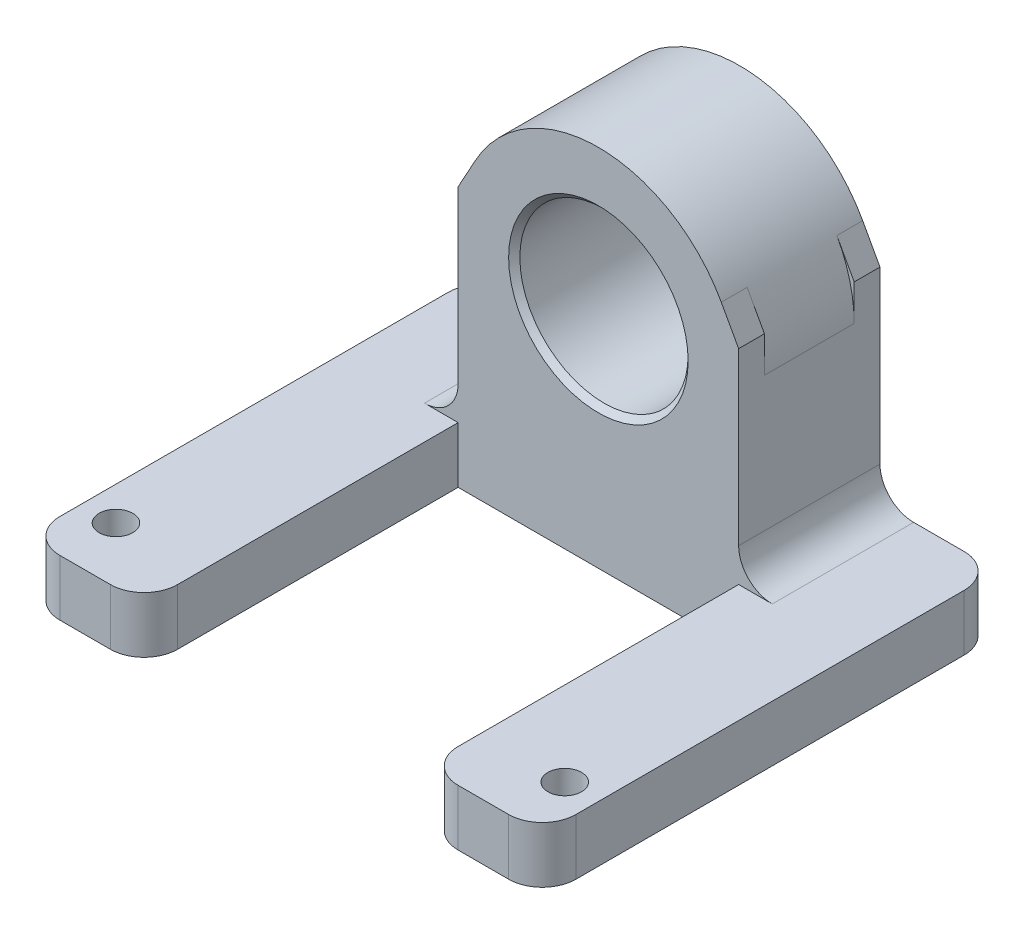
ISO-10303-21;
HEADER;
FILE_DESCRIPTION(('STEP AP214'),'2;1');
FILE_NAME('part.step','',(''),(''),'','','');
FILE_SCHEMA(('AUTOMOTIVE_DESIGN { 1 0 10303 214 1 1 1 1 }'));
ENDSEC;
DATA;
#1=APPLICATION_CONTEXT('core data for automotive mechanical design processes');
#2=APPLICATION_PROTOCOL_DEFINITION('international standard','automotive_design',2000,#1);
#3=PRODUCT_CONTEXT('',#1,'mechanical');
#4=PRODUCT('Part','Part','',(#3));
#5=PRODUCT_RELATED_PRODUCT_CATEGORY('part','',(#4));
#6=PRODUCT_DEFINITION_FORMATION('','',#4);
#7=PRODUCT_DEFINITION_CONTEXT('part definition',#1,'design');
#8=PRODUCT_DEFINITION('design','',#6,#7);
#9=PRODUCT_DEFINITION_SHAPE('','',#8);
#10=(LENGTH_UNIT() NAMED_UNIT(*) SI_UNIT(.MILLI.,.METRE.));
#11=(NAMED_UNIT(*) PLANE_ANGLE_UNIT() SI_UNIT($,.RADIAN.));
#12=(NAMED_UNIT(*) SI_UNIT($,.STERADIAN.) SOLID_ANGLE_UNIT());
#13=UNCERTAINTY_MEASURE_WITH_UNIT(LENGTH_MEASURE(1.E-05),#10,'distance_accuracy_value','');
#14=(GEOMETRIC_REPRESENTATION_CONTEXT(3) GLOBAL_UNCERTAINTY_ASSIGNED_CONTEXT((#13)) GLOBAL_UNIT_ASSIGNED_CONTEXT((#10,
#11,#12)) REPRESENTATION_CONTEXT('',''));
#15=CARTESIAN_POINT('',(0.,0.,0.));
#16=DIRECTION('',(0.,0.,1.));
#17=DIRECTION('',(1.,0.,0.));
#18=AXIS2_PLACEMENT_3D('',#15,#16,#17);
#19=CARTESIAN_POINT('',(22.5,-15.,-4.));
#20=DIRECTION('',(0.,-1.,0.));
#21=DIRECTION('',(1.,0.,0.));
#22=AXIS2_PLACEMENT_3D('',#19,#20,#21);
#23=PLANE('',#22);
#24=DIRECTION('',(-1.,0.,0.));
#25=VECTOR('',#24,1.);
#26=CARTESIAN_POINT('',(-22.5,-15.,-6.3));
#27=LINE('',#26,#25);
#28=CARTESIAN_POINT('',(-15.5,-15.,-6.3));
#29=VERTEX_POINT('',#28);
#30=CARTESIAN_POINT('',(-20.,-15.,-6.3));
#31=VERTEX_POINT('',#30);
#32=EDGE_CURVE('E294',#29,#31,#27,.T.);
#33=ORIENTED_EDGE('',*,*,#32,.T.);
#34=CARTESIAN_POINT('',(-20.,-15.,-3.3));
#35=DIRECTION('',(0.,-1.,0.));
#36=DIRECTION('',(1.,0.,0.));
#37=AXIS2_PLACEMENT_3D('',#34,#35,#36);
#38=CIRCLE('',#37,3.);
#39=CARTESIAN_POINT('',(-23.,-15.,-3.3));
#40=VERTEX_POINT('',#39);
#41=EDGE_CURVE('E475',#31,#40,#38,.F.);
#42=ORIENTED_EDGE('',*,*,#41,.T.);
#43=DIRECTION('',(0.,0.,1.));
#44=VECTOR('',#43,1.);
#45=CARTESIAN_POINT('',(-23.,-15.,-6.3));
#46=LINE('',#45,#44);
#47=CARTESIAN_POINT('',(-23.,-15.,31.3));
#48=VERTEX_POINT('',#47);
#49=EDGE_CURVE('E312',#40,#48,#46,.T.);
#50=ORIENTED_EDGE('',*,*,#49,.T.);
#51=CARTESIAN_POINT('',(-20.,-15.,31.3));
#52=DIRECTION('',(0.,-1.,0.));
#53=DIRECTION('',(1.,0.,0.));
#54=AXIS2_PLACEMENT_3D('',#51,#52,#53);
#55=CIRCLE('',#54,3.);
#56=CARTESIAN_POINT('',(-20.,-15.,34.3));
#57=VERTEX_POINT('',#56);
#58=EDGE_CURVE('E472',#48,#57,#55,.F.);
#59=ORIENTED_EDGE('',*,*,#58,.T.);
#60=DIRECTION('',(-1.,0.,0.));
#61=VECTOR('',#60,1.);
#62=CARTESIAN_POINT('',(-22.5,-15.,34.3));
#63=LINE('',#62,#61);
#64=CARTESIAN_POINT('',(-15.5,-15.,34.3));
#65=VERTEX_POINT('',#64);
#66=EDGE_CURVE('E283',#65,#57,#63,.T.);
#67=ORIENTED_EDGE('',*,*,#66,.F.);
#68=CARTESIAN_POINT('',(-15.5,-15.,31.3));
#69=DIRECTION('',(0.,-1.,0.));
#70=DIRECTION('',(1.,0.,0.));
#71=AXIS2_PLACEMENT_3D('',#68,#69,#70);
#72=CIRCLE('',#71,3.);
#73=CARTESIAN_POINT('',(-12.5,-15.,31.3));
#74=VERTEX_POINT('',#73);
#75=EDGE_CURVE('E469',#65,#74,#72,.F.);
#76=ORIENTED_EDGE('',*,*,#75,.T.);
#77=DIRECTION('',(0.,0.,-1.));
#78=VECTOR('',#77,1.);
#79=CARTESIAN_POINT('',(-12.5,-15.,-4.));
#80=LINE('',#79,#78);
#81=CARTESIAN_POINT('',(-12.5,-15.,6.3));
#82=VERTEX_POINT('',#81);
#83=EDGE_CURVE('E254',#74,#82,#80,.T.);
#84=ORIENTED_EDGE('',*,*,#83,.T.);
#85=DIRECTION('',(-1.,0.,0.));
#86=VECTOR('',#85,1.);
#87=CARTESIAN_POINT('',(22.5,-15.,6.3));
#88=LINE('',#87,#86);
#89=CARTESIAN_POINT('',(-15.5,-15.,6.3));
#90=VERTEX_POINT('',#89);
#91=EDGE_CURVE('E63',#82,#90,#88,.T.);
#92=ORIENTED_EDGE('',*,*,#91,.T.);
#93=DIRECTION('',(0.,0.,1.));
#94=VECTOR('',#93,1.);
#95=CARTESIAN_POINT('',(-15.5,-15.,-6.3));
#96=LINE('',#95,#94);
#97=EDGE_CURVE('E464',#90,#29,#96,.F.);
#98=ORIENTED_EDGE('',*,*,#97,.T.);
#99=EDGE_LOOP('',(#33,#42,#50,#59,#67,#76,#84,#92,#98));
#100=FACE_BOUND('',#99,.T.);
#101=CARTESIAN_POINT('',(-20.,-15.,29.3));
#102=DIRECTION('',(0.,-1.,0.));
#103=DIRECTION('',(1.,0.,0.));
#104=AXIS2_PLACEMENT_3D('',#101,#102,#103);
#105=CIRCLE('',#104,1.5);
#106=CARTESIAN_POINT('',(-18.5,-15.,29.3));
#107=VERTEX_POINT('',#106);
#108=EDGE_CURVE('E288',#107,#107,#105,.T.);
#109=ORIENTED_EDGE('',*,*,#108,.T.);
#110=EDGE_LOOP('',(#109));
#111=FACE_BOUND('',#110,.T.);
#112=ADVANCED_FACE('F47',(#100,#111),#23,.F.);
#113=CARTESIAN_POINT('',(0.,0.,34.3));
#114=DIRECTION('',(0.,0.,-1.));
#115=DIRECTION('',(-1.,0.,0.));
#116=AXIS2_PLACEMENT_3D('',#113,#114,#115);
#117=PLANE('',#116);
#118=ORIENTED_EDGE('',*,*,#66,.T.);
#119=DIRECTION('',(0.,-1.,0.));
#120=VECTOR('',#119,1.);
#121=CARTESIAN_POINT('',(-20.,-20.,34.3));
#122=LINE('',#121,#120);
#123=CARTESIAN_POINT('',(-20.,-20.,34.3));
#124=VERTEX_POINT('',#123);
#125=EDGE_CURVE('E482',#57,#124,#122,.T.);
#126=ORIENTED_EDGE('',*,*,#125,.T.);
#127=DIRECTION('',(1.,0.,0.));
#128=VECTOR('',#127,1.);
#129=CARTESIAN_POINT('',(-22.5,-20.,34.3));
#130=LINE('',#129,#128);
#131=CARTESIAN_POINT('',(-15.5,-20.,34.3));
#132=VERTEX_POINT('',#131);
#133=EDGE_CURVE('E293',#124,#132,#130,.T.);
#134=ORIENTED_EDGE('',*,*,#133,.T.);
#135=DIRECTION('',(0.,1.,0.));
#136=VECTOR('',#135,1.);
#137=CARTESIAN_POINT('',(-15.5,0.,34.3));
#138=LINE('',#137,#136);
#139=EDGE_CURVE('E478',#132,#65,#138,.T.);
#140=ORIENTED_EDGE('',*,*,#139,.T.);
#141=EDGE_LOOP('',(#118,#126,#134,#140));
#142=FACE_BOUND('',#141,.T.);
#143=ADVANCED_FACE('F639',(#142),#117,.F.);
#144=CARTESIAN_POINT('',(22.5,-15.,6.3));
#145=DIRECTION('',(-0.876495540852586,-0.481409977945547,0.));
#146=DIRECTION('',(0.481409977945547,-0.876495540852586,0.));
#147=AXIS2_PLACEMENT_3D('',#144,#145,#146);
#148=PLANE('',#147);
#149=DIRECTION('',(-0.481409977945547,0.876495540852586,0.));
#150=VECTOR('',#149,1.);
#151=CARTESIAN_POINT('',(22.5,-15.,-4.));
#152=LINE('',#151,#150);
#153=CARTESIAN_POINT('',(12.5,3.2068420059156,-4.));
#154=VERTEX_POINT('',#153);
#155=CARTESIAN_POINT('',(10.9561942606573,6.01762472431933,-4.));
#156=VERTEX_POINT('',#155);
#157=EDGE_CURVE('E316',#154,#156,#152,.T.);
#158=ORIENTED_EDGE('',*,*,#157,.F.);
#159=DIRECTION('',(0.,0.,-1.));
#160=VECTOR('',#159,1.);
#161=CARTESIAN_POINT('',(12.5,3.2068420059156,6.3));
#162=LINE('',#161,#160);
#163=CARTESIAN_POINT('',(12.5,3.20684200591559,-6.3));
#164=VERTEX_POINT('',#163);
#165=EDGE_CURVE('E547',#154,#164,#162,.T.);
#166=ORIENTED_EDGE('',*,*,#165,.T.);
#167=DIRECTION('',(-0.481409977945547,0.876495540852586,0.));
#168=VECTOR('',#167,1.);
#169=CARTESIAN_POINT('',(22.5,-15.,-6.3));
#170=LINE('',#169,#168);
#171=CARTESIAN_POINT('',(10.9561942606573,6.01762472431933,-6.3));
#172=VERTEX_POINT('',#171);
#173=EDGE_CURVE('E335',#164,#172,#170,.T.);
#174=ORIENTED_EDGE('',*,*,#173,.T.);
#175=DIRECTION('',(0.,0.,-1.));
#176=VECTOR('',#175,1.);
#177=CARTESIAN_POINT('',(10.9561942606573,6.01762472431933,6.3));
#178=LINE('',#177,#176);
#179=EDGE_CURVE('E382',#156,#172,#178,.T.);
#180=ORIENTED_EDGE('',*,*,#179,.F.);
#181=EDGE_LOOP('',(#158,#166,#174,#180));
#182=FACE_BOUND('',#181,.T.);
#183=ADVANCED_FACE('F596',(#182),#148,.F.);
#184=CARTESIAN_POINT('',(-22.5,-15.,6.3));
#185=DIRECTION('',(0.876495540852587,-0.481409977945547,0.));
#186=DIRECTION('',(0.481409977945547,0.876495540852587,0.));
#187=AXIS2_PLACEMENT_3D('',#184,#185,#186);
#188=PLANE('',#187);
#189=DIRECTION('',(-0.481409977945547,-0.876495540852586,0.));
#190=VECTOR('',#189,1.);
#191=CARTESIAN_POINT('',(-22.5,-15.,-6.3));
#192=LINE('',#191,#190);
#193=CARTESIAN_POINT('',(-10.9561942606573,6.01762472431933,-6.3));
#194=VERTEX_POINT('',#193);
#195=CARTESIAN_POINT('',(-12.5,3.20684200591561,-6.3));
#196=VERTEX_POINT('',#195);
#197=EDGE_CURVE('E371',#194,#196,#192,.T.);
#198=ORIENTED_EDGE('',*,*,#197,.T.);
#199=DIRECTION('',(0.,0.,1.));
#200=VECTOR('',#199,1.);
#201=CARTESIAN_POINT('',(-12.5,3.2068420059156,6.3));
#202=LINE('',#201,#200);
#203=CARTESIAN_POINT('',(-12.5,3.2068420059156,-4.));
#204=VERTEX_POINT('',#203);
#205=EDGE_CURVE('E532',#196,#204,#202,.T.);
#206=ORIENTED_EDGE('',*,*,#205,.T.);
#207=DIRECTION('',(-0.481409977945547,-0.876495540852586,0.));
#208=VECTOR('',#207,1.);
#209=CARTESIAN_POINT('',(-10.9561942606573,6.01762472431933,-4.));
#210=LINE('',#209,#208);
#211=CARTESIAN_POINT('',(-10.9561942606573,6.01762472431933,-4.));
#212=VERTEX_POINT('',#211);
#213=EDGE_CURVE('E336',#212,#204,#210,.T.);
#214=ORIENTED_EDGE('',*,*,#213,.F.);
#215=DIRECTION('',(0.,0.,-1.));
#216=VECTOR('',#215,1.);
#217=CARTESIAN_POINT('',(-10.9561942606573,6.01762472431933,6.3));
#218=LINE('',#217,#216);
#219=EDGE_CURVE('E364',#212,#194,#218,.T.);
#220=ORIENTED_EDGE('',*,*,#219,.T.);
#221=EDGE_LOOP('',(#198,#206,#214,#220));
#222=FACE_BOUND('',#221,.T.);
#223=ADVANCED_FACE('F585',(#222),#188,.F.);
#224=CARTESIAN_POINT('',(0.,0.,6.3));
#225=DIRECTION('',(0.,0.,1.));
#226=DIRECTION('',(1.,0.,0.));
#227=AXIS2_PLACEMENT_3D('',#224,#225,#226);
#228=PLANE('',#227);
#229=DIRECTION('',(0.,1.,0.));
#230=VECTOR('',#229,1.);
#231=CARTESIAN_POINT('',(-12.5,-15.,6.3));
#232=LINE('',#231,#230);
#233=CARTESIAN_POINT('',(-12.5,-12.,6.3));
#234=VERTEX_POINT('',#233);
#235=CARTESIAN_POINT('',(-12.5,3.20684200591561,6.3));
#236=VERTEX_POINT('',#235);
#237=EDGE_CURVE('E566',#234,#236,#232,.T.);
#238=ORIENTED_EDGE('',*,*,#237,.F.);
#239=CARTESIAN_POINT('',(-15.5,-12.,6.3));
#240=DIRECTION('',(0.,0.,1.));
#241=DIRECTION('',(1.,0.,0.));
#242=AXIS2_PLACEMENT_3D('',#239,#240,#241);
#243=CIRCLE('',#242,3.);
#244=EDGE_CURVE('E505',#234,#90,#243,.F.);
#245=ORIENTED_EDGE('',*,*,#244,.T.);
#246=ORIENTED_EDGE('',*,*,#91,.F.);
#247=DIRECTION('',(0.,1.,0.));
#248=VECTOR('',#247,1.);
#249=CARTESIAN_POINT('',(-12.5,-20.,6.3));
#250=LINE('',#249,#248);
#251=CARTESIAN_POINT('',(-12.5,-20.,6.3));
#252=VERTEX_POINT('',#251);
#253=EDGE_CURVE('E255',#252,#82,#250,.T.);
#254=ORIENTED_EDGE('',*,*,#253,.F.);
#255=DIRECTION('',(-1.,0.,0.));
#256=VECTOR('',#255,1.);
#257=CARTESIAN_POINT('',(-12.5,-20.,6.3));
#258=LINE('',#257,#256);
#259=CARTESIAN_POINT('',(12.5,-20.,6.3));
#260=VERTEX_POINT('',#259);
#261=EDGE_CURVE('E261',#260,#252,#258,.T.);
#262=ORIENTED_EDGE('',*,*,#261,.F.);
#263=DIRECTION('',(0.,1.,0.));
#264=VECTOR('',#263,1.);
#265=CARTESIAN_POINT('',(12.5,-20.,6.3));
#266=LINE('',#265,#264);
#267=CARTESIAN_POINT('',(12.5,-15.,6.3));
#268=VERTEX_POINT('',#267);
#269=EDGE_CURVE('E249',#260,#268,#266,.T.);
#270=ORIENTED_EDGE('',*,*,#269,.T.);
#271=DIRECTION('',(-1.,0.,0.));
#272=VECTOR('',#271,1.);
#273=CARTESIAN_POINT('',(22.5,-15.,6.3));
#274=LINE('',#273,#272);
#275=CARTESIAN_POINT('',(15.5,-15.,6.3));
#276=VERTEX_POINT('',#275);
#277=EDGE_CURVE('E231',#276,#268,#274,.T.);
#278=ORIENTED_EDGE('',*,*,#277,.F.);
#279=CARTESIAN_POINT('',(15.5,-12.,6.3));
#280=DIRECTION('',(0.,0.,1.));
#281=DIRECTION('',(1.,0.,0.));
#282=AXIS2_PLACEMENT_3D('',#279,#280,#281);
#283=CIRCLE('',#282,3.);
#284=CARTESIAN_POINT('',(12.5,-12.,6.3));
#285=VERTEX_POINT('',#284);
#286=EDGE_CURVE('E56',#276,#285,#283,.F.);
#287=ORIENTED_EDGE('',*,*,#286,.T.);
#288=DIRECTION('',(0.,-1.,0.));
#289=VECTOR('',#288,1.);
#290=CARTESIAN_POINT('',(12.5,-15.,6.3));
#291=LINE('',#290,#289);
#292=CARTESIAN_POINT('',(12.5,3.2068420059156,6.3));
#293=VERTEX_POINT('',#292);
#294=EDGE_CURVE('E563',#293,#285,#291,.T.);
#295=ORIENTED_EDGE('',*,*,#294,.F.);
#296=DIRECTION('',(-0.481409977945547,0.876495540852586,0.));
#297=VECTOR('',#296,1.);
#298=CARTESIAN_POINT('',(22.5,-15.,6.3));
#299=LINE('',#298,#297);
#300=CARTESIAN_POINT('',(10.9561942606573,6.01762472431933,6.3));
#301=VERTEX_POINT('',#300);
#302=EDGE_CURVE('E353',#293,#301,#299,.T.);
#303=ORIENTED_EDGE('',*,*,#302,.T.);
#304=CARTESIAN_POINT('',(0.,0.,6.3));
#305=DIRECTION('',(0.,0.,1.));
#306=DIRECTION('',(1.,0.,0.));
#307=AXIS2_PLACEMENT_3D('',#304,#305,#306);
#308=CIRCLE('',#307,12.5);
#309=CARTESIAN_POINT('',(-10.9561942606573,6.01762472431933,6.3));
#310=VERTEX_POINT('',#309);
#311=EDGE_CURVE('E356',#301,#310,#308,.T.);
#312=ORIENTED_EDGE('',*,*,#311,.T.);
#313=DIRECTION('',(-0.481409977945547,-0.876495540852586,0.));
#314=VECTOR('',#313,1.);
#315=CARTESIAN_POINT('',(-22.5,-15.,6.3));
#316=LINE('',#315,#314);
#317=EDGE_CURVE('E360',#310,#236,#316,.T.);
#318=ORIENTED_EDGE('',*,*,#317,.T.);
#319=EDGE_LOOP('',(#238,#245,#246,#254,#262,#270,#278,#287,#295,#303,#312,#318));
#320=FACE_BOUND('',#319,.T.);
#321=CARTESIAN_POINT('',(0.,0.,6.3));
#322=DIRECTION('',(0.,0.,1.));
#323=DIRECTION('',(1.,0.,0.));
#324=AXIS2_PLACEMENT_3D('',#321,#322,#323);
#325=CIRCLE('',#324,8.00000000000001);
#326=CARTESIAN_POINT('',(8.00000000000001,0.,6.3));
#327=VERTEX_POINT('',#326);
#328=EDGE_CURVE('E399',#327,#327,#325,.F.);
#329=ORIENTED_EDGE('',*,*,#328,.T.);
#330=EDGE_LOOP('',(#329));
#331=FACE_BOUND('',#330,.T.);
#332=ADVANCED_FACE('F258',(#320,#331),#228,.T.);
#333=CARTESIAN_POINT('',(0.,0.,-6.3));
#334=DIRECTION('',(0.,0.,1.));
#335=DIRECTION('',(1.,0.,0.));
#336=AXIS2_PLACEMENT_3D('',#333,#334,#335);
#337=PLANE('',#336);
#338=CARTESIAN_POINT('',(0.,0.,-6.3));
#339=DIRECTION('',(0.,0.,1.));
#340=DIRECTION('',(1.,0.,0.));
#341=AXIS2_PLACEMENT_3D('',#338,#339,#340);
#342=CIRCLE('',#341,7.99999999999999);
#343=CARTESIAN_POINT('',(7.99999999999999,0.,-6.3));
#344=VERTEX_POINT('',#343);
#345=EDGE_CURVE('E387',#344,#344,#342,.T.);
#346=ORIENTED_EDGE('',*,*,#345,.T.);
#347=EDGE_LOOP('',(#346));
#348=FACE_BOUND('',#347,.T.);
#349=CARTESIAN_POINT('',(20.,-15.,-6.3));
#350=VERTEX_POINT('',#349);
#351=CARTESIAN_POINT('',(15.5,-15.,-6.3));
#352=VERTEX_POINT('',#351);
#353=EDGE_CURVE('E298',#350,#352,#27,.T.);
#354=ORIENTED_EDGE('',*,*,#353,.F.);
#355=DIRECTION('',(0.,1.,0.));
#356=VECTOR('',#355,1.);
#357=CARTESIAN_POINT('',(20.,-20.,-6.3));
#358=LINE('',#357,#356);
#359=CARTESIAN_POINT('',(20.,-20.,-6.3));
#360=VERTEX_POINT('',#359);
#361=EDGE_CURVE('E436',#350,#360,#358,.F.);
#362=ORIENTED_EDGE('',*,*,#361,.T.);
#363=DIRECTION('',(1.,0.,0.));
#364=VECTOR('',#363,1.);
#365=CARTESIAN_POINT('',(-22.5,-20.,-6.3));
#366=LINE('',#365,#364);
#367=CARTESIAN_POINT('',(-20.,-20.,-6.3));
#368=VERTEX_POINT('',#367);
#369=EDGE_CURVE('E357',#368,#360,#366,.T.);
#370=ORIENTED_EDGE('',*,*,#369,.F.);
#371=DIRECTION('',(0.,-1.,0.));
#372=VECTOR('',#371,1.);
#373=CARTESIAN_POINT('',(-20.,-15.,-6.3));
#374=LINE('',#373,#372);
#375=EDGE_CURVE('E433',#368,#31,#374,.F.);
#376=ORIENTED_EDGE('',*,*,#375,.T.);
#377=ORIENTED_EDGE('',*,*,#32,.F.);
#378=CARTESIAN_POINT('',(-15.5,-12.,-6.3));
#379=DIRECTION('',(0.,0.,1.));
#380=DIRECTION('',(1.,0.,0.));
#381=AXIS2_PLACEMENT_3D('',#378,#379,#380);
#382=CIRCLE('',#381,3.);
#383=CARTESIAN_POINT('',(-12.5,-12.,-6.3));
#384=VERTEX_POINT('',#383);
#385=EDGE_CURVE('E508',#29,#384,#382,.T.);
#386=ORIENTED_EDGE('',*,*,#385,.T.);
#387=DIRECTION('',(0.,1.,0.));
#388=VECTOR('',#387,1.);
#389=CARTESIAN_POINT('',(-12.5,-15.,-6.3));
#390=LINE('',#389,#388);
#391=EDGE_CURVE('E558',#384,#196,#390,.T.);
#392=ORIENTED_EDGE('',*,*,#391,.T.);
#393=ORIENTED_EDGE('',*,*,#197,.F.);
#394=CARTESIAN_POINT('',(0.,0.,-6.3));
#395=DIRECTION('',(0.,0.,1.));
#396=DIRECTION('',(1.,0.,0.));
#397=AXIS2_PLACEMENT_3D('',#394,#395,#396);
#398=CIRCLE('',#397,12.5);
#399=EDGE_CURVE('E367',#172,#194,#398,.T.);
#400=ORIENTED_EDGE('',*,*,#399,.F.);
#401=ORIENTED_EDGE('',*,*,#173,.F.);
#402=DIRECTION('',(0.,-1.,0.));
#403=VECTOR('',#402,1.);
#404=CARTESIAN_POINT('',(12.5,-15.,-6.3));
#405=LINE('',#404,#403);
#406=CARTESIAN_POINT('',(12.5,-12.,-6.3));
#407=VERTEX_POINT('',#406);
#408=EDGE_CURVE('E559',#164,#407,#405,.T.);
#409=ORIENTED_EDGE('',*,*,#408,.T.);
#410=CARTESIAN_POINT('',(15.5,-12.,-6.3));
#411=DIRECTION('',(0.,0.,1.));
#412=DIRECTION('',(1.,0.,0.));
#413=AXIS2_PLACEMENT_3D('',#410,#411,#412);
#414=CIRCLE('',#413,3.);
#415=EDGE_CURVE('E11',#407,#352,#414,.T.);
#416=ORIENTED_EDGE('',*,*,#415,.T.);
#417=EDGE_LOOP('',(#354,#362,#370,#376,#377,#386,#392,#393,#400,#401,#409,#416));
#418=FACE_BOUND('',#417,.T.);
#419=ADVANCED_FACE('F575',(#348,#418),#337,.F.);
#420=ORIENTED_EDGE('',*,*,#302,.F.);
#421=DIRECTION('',(0.,0.,-1.));
#422=VECTOR('',#421,1.);
#423=CARTESIAN_POINT('',(12.5,3.2068420059156,6.3));
#424=LINE('',#423,#422);
#425=CARTESIAN_POINT('',(12.5,3.2068420059156,4.));
#426=VERTEX_POINT('',#425);
#427=EDGE_CURVE('E554',#293,#426,#424,.T.);
#428=ORIENTED_EDGE('',*,*,#427,.T.);
#429=DIRECTION('',(-0.481409977945547,0.876495540852586,0.));
#430=VECTOR('',#429,1.);
#431=CARTESIAN_POINT('',(22.5,-15.,4.));
#432=LINE('',#431,#430);
#433=CARTESIAN_POINT('',(10.9561942606573,6.01762472431933,4.));
#434=VERTEX_POINT('',#433);
#435=EDGE_CURVE('E325',#426,#434,#432,.T.);
#436=ORIENTED_EDGE('',*,*,#435,.T.);
#437=EDGE_CURVE('E383',#301,#434,#178,.T.);
#438=ORIENTED_EDGE('',*,*,#437,.F.);
#439=EDGE_LOOP('',(#420,#428,#436,#438));
#440=FACE_BOUND('',#439,.T.);
#441=ADVANCED_FACE('F608',(#440),#148,.F.);
#442=CARTESIAN_POINT('',(0.,0.,6.3));
#443=DIRECTION('',(0.,0.,-1.));
#444=DIRECTION('',(-1.,0.,0.));
#445=AXIS2_PLACEMENT_3D('',#442,#443,#444);
#446=CYLINDRICAL_SURFACE('',#445,12.5);
#447=ORIENTED_EDGE('',*,*,#399,.T.);
#448=ORIENTED_EDGE('',*,*,#219,.F.);
#449=CARTESIAN_POINT('',(0.,0.,-4.));
#450=DIRECTION('',(0.,0.,-1.));
#451=DIRECTION('',(1.,0.,0.));
#452=AXIS2_PLACEMENT_3D('',#449,#450,#451);
#453=CIRCLE('',#452,12.5);
#454=CARTESIAN_POINT('',(-12.5,0.,-4.));
#455=VERTEX_POINT('',#454);
#456=EDGE_CURVE('E340',#455,#212,#453,.T.);
#457=ORIENTED_EDGE('',*,*,#456,.F.);
#458=DIRECTION('',(0.,0.,1.));
#459=VECTOR('',#458,1.);
#460=CARTESIAN_POINT('',(-12.5,0.,-4.));
#461=LINE('',#460,#459);
#462=CARTESIAN_POINT('',(-12.5,0.,4.));
#463=VERTEX_POINT('',#462);
#464=EDGE_CURVE('E328',#455,#463,#461,.T.);
#465=ORIENTED_EDGE('',*,*,#464,.T.);
#466=CARTESIAN_POINT('',(0.,0.,4.));
#467=DIRECTION('',(0.,0.,-1.));
#468=DIRECTION('',(1.,0.,0.));
#469=AXIS2_PLACEMENT_3D('',#466,#467,#468);
#470=CIRCLE('',#469,12.5);
#471=CARTESIAN_POINT('',(-10.9561942606573,6.01762472431933,4.));
#472=VERTEX_POINT('',#471);
#473=EDGE_CURVE('E341',#463,#472,#470,.T.);
#474=ORIENTED_EDGE('',*,*,#473,.T.);
#475=EDGE_CURVE('E378',#310,#472,#218,.T.);
#476=ORIENTED_EDGE('',*,*,#475,.F.);
#477=ORIENTED_EDGE('',*,*,#311,.F.);
#478=ORIENTED_EDGE('',*,*,#437,.T.);
#479=CARTESIAN_POINT('',(0.,0.,4.));
#480=DIRECTION('',(0.,0.,-1.));
#481=DIRECTION('',(1.,0.,0.));
#482=AXIS2_PLACEMENT_3D('',#479,#480,#481);
#483=CIRCLE('',#482,12.5);
#484=CARTESIAN_POINT('',(12.5,0.,4.));
#485=VERTEX_POINT('',#484);
#486=EDGE_CURVE('E320',#434,#485,#483,.T.);
#487=ORIENTED_EDGE('',*,*,#486,.T.);
#488=DIRECTION('',(0.,0.,1.));
#489=VECTOR('',#488,1.);
#490=CARTESIAN_POINT('',(12.5,0.,-4.));
#491=LINE('',#490,#489);
#492=CARTESIAN_POINT('',(12.5,0.,-4.));
#493=VERTEX_POINT('',#492);
#494=EDGE_CURVE('E324',#493,#485,#491,.T.);
#495=ORIENTED_EDGE('',*,*,#494,.F.);
#496=CARTESIAN_POINT('',(0.,0.,-4.));
#497=DIRECTION('',(0.,0.,-1.));
#498=DIRECTION('',(1.,0.,0.));
#499=AXIS2_PLACEMENT_3D('',#496,#497,#498);
#500=CIRCLE('',#499,12.5);
#501=EDGE_CURVE('E319',#156,#493,#500,.T.);
#502=ORIENTED_EDGE('',*,*,#501,.F.);
#503=ORIENTED_EDGE('',*,*,#179,.T.);
#504=EDGE_LOOP('',(#447,#448,#457,#465,#474,#476,#477,#478,#487,#495,#502,#503));
#505=FACE_BOUND('',#504,.T.);
#506=ADVANCED_FACE('F589',(#505),#446,.T.);
#507=DIRECTION('',(-0.481409977945547,-0.876495540852586,0.));
#508=VECTOR('',#507,1.);
#509=CARTESIAN_POINT('',(-10.9561942606573,6.01762472431933,4.));
#510=LINE('',#509,#508);
#511=CARTESIAN_POINT('',(-12.5,3.2068420059156,4.));
#512=VERTEX_POINT('',#511);
#513=EDGE_CURVE('E303',#472,#512,#510,.T.);
#514=ORIENTED_EDGE('',*,*,#513,.T.);
#515=DIRECTION('',(0.,0.,1.));
#516=VECTOR('',#515,1.);
#517=CARTESIAN_POINT('',(-12.5,3.2068420059156,6.3));
#518=LINE('',#517,#516);
#519=EDGE_CURVE('E543',#512,#236,#518,.T.);
#520=ORIENTED_EDGE('',*,*,#519,.T.);
#521=ORIENTED_EDGE('',*,*,#317,.F.);
#522=ORIENTED_EDGE('',*,*,#475,.T.);
#523=EDGE_LOOP('',(#514,#520,#521,#522));
#524=FACE_BOUND('',#523,.T.);
#525=ADVANCED_FACE('F681',(#524),#188,.F.);
#526=CARTESIAN_POINT('',(-22.5,-20.,6.3));
#527=DIRECTION('',(0.,1.,0.));
#528=DIRECTION('',(-1.,0.,0.));
#529=AXIS2_PLACEMENT_3D('',#526,#527,#528);
#530=PLANE('',#529);
#531=CARTESIAN_POINT('',(-20.,-20.,29.3));
#532=DIRECTION('',(0.,1.,0.));
#533=DIRECTION('',(0.,0.,1.));
#534=AXIS2_PLACEMENT_3D('',#531,#532,#533);
#535=CIRCLE('',#534,1.5);
#536=CARTESIAN_POINT('',(-20.,-20.,30.8));
#537=VERTEX_POINT('',#536);
#538=EDGE_CURVE('E275',#537,#537,#535,.T.);
#539=ORIENTED_EDGE('',*,*,#538,.T.);
#540=EDGE_LOOP('',(#539));
#541=FACE_BOUND('',#540,.T.);
#542=CARTESIAN_POINT('',(20.,-20.,29.3));
#543=DIRECTION('',(0.,1.,0.));
#544=DIRECTION('',(0.,0.,-1.));
#545=AXIS2_PLACEMENT_3D('',#542,#543,#544);
#546=CIRCLE('',#545,1.5);
#547=CARTESIAN_POINT('',(20.,-20.,27.8));
#548=VERTEX_POINT('',#547);
#549=EDGE_CURVE('E274',#548,#548,#546,.T.);
#550=ORIENTED_EDGE('',*,*,#549,.T.);
#551=EDGE_LOOP('',(#550));
#552=FACE_BOUND('',#551,.T.);
#553=ORIENTED_EDGE('',*,*,#369,.T.);
#554=CARTESIAN_POINT('',(20.,-20.,-3.3));
#555=DIRECTION('',(0.,1.,0.));
#556=DIRECTION('',(-1.,0.,0.));
#557=AXIS2_PLACEMENT_3D('',#554,#555,#556);
#558=CIRCLE('',#557,3.);
#559=CARTESIAN_POINT('',(23.,-20.,-3.3));
#560=VERTEX_POINT('',#559);
#561=EDGE_CURVE('E454',#360,#560,#558,.F.);
#562=ORIENTED_EDGE('',*,*,#561,.T.);
#563=DIRECTION('',(0.,0.,1.));
#564=VECTOR('',#563,1.);
#565=CARTESIAN_POINT('',(23.,-20.,-6.3));
#566=LINE('',#565,#564);
#567=CARTESIAN_POINT('',(23.,-20.,31.3));
#568=VERTEX_POINT('',#567);
#569=EDGE_CURVE('E304',#560,#568,#566,.T.);
#570=ORIENTED_EDGE('',*,*,#569,.T.);
#571=CARTESIAN_POINT('',(20.,-20.,31.3));
#572=DIRECTION('',(0.,1.,0.));
#573=DIRECTION('',(-1.,0.,0.));
#574=AXIS2_PLACEMENT_3D('',#571,#572,#573);
#575=CIRCLE('',#574,3.);
#576=CARTESIAN_POINT('',(20.,-20.,34.3));
#577=VERTEX_POINT('',#576);
#578=EDGE_CURVE('E439',#568,#577,#575,.F.);
#579=ORIENTED_EDGE('',*,*,#578,.T.);
#580=CARTESIAN_POINT('',(15.5,-20.,34.3));
#581=VERTEX_POINT('',#580);
#582=EDGE_CURVE('E289',#581,#577,#130,.T.);
#583=ORIENTED_EDGE('',*,*,#582,.F.);
#584=CARTESIAN_POINT('',(15.5,-20.,31.3));
#585=DIRECTION('',(0.,1.,0.));
#586=DIRECTION('',(-1.,0.,0.));
#587=AXIS2_PLACEMENT_3D('',#584,#585,#586);
#588=CIRCLE('',#587,3.);
#589=CARTESIAN_POINT('',(12.5,-20.,31.3));
#590=VERTEX_POINT('',#589);
#591=EDGE_CURVE('E442',#581,#590,#588,.F.);
#592=ORIENTED_EDGE('',*,*,#591,.T.);
#593=DIRECTION('',(0.,0.,-1.));
#594=VECTOR('',#593,1.);
#595=CARTESIAN_POINT('',(12.5,-20.,6.3));
#596=LINE('',#595,#594);
#597=EDGE_CURVE('E530',#590,#260,#596,.T.);
#598=ORIENTED_EDGE('',*,*,#597,.T.);
#599=ORIENTED_EDGE('',*,*,#261,.T.);
#600=DIRECTION('',(0.,0.,1.));
#601=VECTOR('',#600,1.);
#602=CARTESIAN_POINT('',(-12.5,-20.,6.3));
#603=LINE('',#602,#601);
#604=CARTESIAN_POINT('',(-12.5,-20.,31.3));
#605=VERTEX_POINT('',#604);
#606=EDGE_CURVE('E263',#252,#605,#603,.T.);
#607=ORIENTED_EDGE('',*,*,#606,.T.);
#608=CARTESIAN_POINT('',(-15.5,-20.,31.3));
#609=DIRECTION('',(0.,1.,0.));
#610=DIRECTION('',(-1.,0.,0.));
#611=AXIS2_PLACEMENT_3D('',#608,#609,#610);
#612=CIRCLE('',#611,3.);
#613=EDGE_CURVE('E445',#605,#132,#612,.F.);
#614=ORIENTED_EDGE('',*,*,#613,.T.);
#615=ORIENTED_EDGE('',*,*,#133,.F.);
#616=CARTESIAN_POINT('',(-20.,-20.,31.3));
#617=DIRECTION('',(0.,1.,0.));
#618=DIRECTION('',(-1.,0.,0.));
#619=AXIS2_PLACEMENT_3D('',#616,#617,#618);
#620=CIRCLE('',#619,3.);
#621=CARTESIAN_POINT('',(-23.,-20.,31.3));
#622=VERTEX_POINT('',#621);
#623=EDGE_CURVE('E448',#124,#622,#620,.F.);
#624=ORIENTED_EDGE('',*,*,#623,.T.);
#625=DIRECTION('',(0.,0.,1.));
#626=VECTOR('',#625,1.);
#627=CARTESIAN_POINT('',(-23.,-20.,-6.3));
#628=LINE('',#627,#626);
#629=CARTESIAN_POINT('',(-23.,-20.,-3.3));
#630=VERTEX_POINT('',#629);
#631=EDGE_CURVE('E308',#630,#622,#628,.T.);
#632=ORIENTED_EDGE('',*,*,#631,.F.);
#633=CARTESIAN_POINT('',(-20.,-20.,-3.3));
#634=DIRECTION('',(0.,1.,0.));
#635=DIRECTION('',(-1.,0.,0.));
#636=AXIS2_PLACEMENT_3D('',#633,#634,#635);
#637=CIRCLE('',#636,3.);
#638=EDGE_CURVE('E451',#630,#368,#637,.F.);
#639=ORIENTED_EDGE('',*,*,#638,.T.);
#640=EDGE_LOOP('',(#553,#562,#570,#579,#583,#592,#598,#599,#607,#614,#615,#624,#632,#639));
#641=FACE_BOUND('',#640,.T.);
#642=ADVANCED_FACE('F529',(#541,#552,#641),#530,.F.);
#643=CARTESIAN_POINT('',(0.,0.,6.3));
#644=DIRECTION('',(0.,0.,-1.));
#645=DIRECTION('',(-1.,0.,0.));
#646=AXIS2_PLACEMENT_3D('',#643,#644,#645);
#647=CYLINDRICAL_SURFACE('',#646,7.5);
#648=CARTESIAN_POINT('',(0.,0.,-5.8));
#649=DIRECTION('',(0.,0.,1.));
#650=DIRECTION('',(1.,0.,0.));
#651=AXIS2_PLACEMENT_3D('',#648,#649,#650);
#652=CIRCLE('',#651,7.5);
#653=CARTESIAN_POINT('',(7.5,0.,-5.8));
#654=VERTEX_POINT('',#653);
#655=EDGE_CURVE('E395',#654,#654,#652,.F.);
#656=ORIENTED_EDGE('',*,*,#655,.T.);
#657=EDGE_LOOP('',(#656));
#658=FACE_BOUND('',#657,.T.);
#659=CARTESIAN_POINT('',(0.,0.,5.79999999999999));
#660=DIRECTION('',(0.,0.,1.));
#661=DIRECTION('',(1.,0.,0.));
#662=AXIS2_PLACEMENT_3D('',#659,#660,#661);
#663=CIRCLE('',#662,7.5);
#664=CARTESIAN_POINT('',(7.5,0.,5.79999999999999));
#665=VERTEX_POINT('',#664);
#666=EDGE_CURVE('E391',#665,#665,#663,.T.);
#667=ORIENTED_EDGE('',*,*,#666,.T.);
#668=EDGE_LOOP('',(#667));
#669=FACE_BOUND('',#668,.T.);
#670=ADVANCED_FACE('F670',(#658,#669),#647,.F.);
#671=CARTESIAN_POINT('',(-12.5,-15.,-4.));
#672=DIRECTION('',(1.,0.,0.));
#673=DIRECTION('',(0.,1.,0.));
#674=AXIS2_PLACEMENT_3D('',#671,#672,#673);
#675=PLANE('',#674);
#676=ORIENTED_EDGE('',*,*,#391,.F.);
#677=DIRECTION('',(0.,0.,1.));
#678=VECTOR('',#677,1.);
#679=CARTESIAN_POINT('',(-12.5,-12.,6.3));
#680=LINE('',#679,#678);
#681=EDGE_CURVE('E498',#384,#234,#680,.T.);
#682=ORIENTED_EDGE('',*,*,#681,.T.);
#683=ORIENTED_EDGE('',*,*,#237,.T.);
#684=ORIENTED_EDGE('',*,*,#519,.F.);
#685=DIRECTION('',(0.,1.,0.));
#686=VECTOR('',#685,1.);
#687=CARTESIAN_POINT('',(-12.5,0.,4.));
#688=LINE('',#687,#686);
#689=EDGE_CURVE('E412',#463,#512,#688,.T.);
#690=ORIENTED_EDGE('',*,*,#689,.F.);
#691=ORIENTED_EDGE('',*,*,#464,.F.);
#692=DIRECTION('',(0.,1.,0.));
#693=VECTOR('',#692,1.);
#694=CARTESIAN_POINT('',(-12.5,0.,-4.));
#695=LINE('',#694,#693);
#696=EDGE_CURVE('E538',#455,#204,#695,.T.);
#697=ORIENTED_EDGE('',*,*,#696,.T.);
#698=ORIENTED_EDGE('',*,*,#205,.F.);
#699=EDGE_LOOP('',(#676,#682,#683,#684,#690,#691,#697,#698));
#700=FACE_BOUND('',#699,.T.);
#701=ADVANCED_FACE('F581',(#700),#675,.F.);
#702=CARTESIAN_POINT('',(0.,0.,-4.));
#703=DIRECTION('',(0.,0.,1.));
#704=DIRECTION('',(1.,0.,0.));
#705=AXIS2_PLACEMENT_3D('',#702,#703,#704);
#706=PLANE('',#705);
#707=ORIENTED_EDGE('',*,*,#696,.F.);
#708=ORIENTED_EDGE('',*,*,#456,.T.);
#709=ORIENTED_EDGE('',*,*,#213,.T.);
#710=EDGE_LOOP('',(#707,#708,#709));
#711=FACE_BOUND('',#710,.T.);
#712=ADVANCED_FACE('F658',(#711),#706,.T.);
#713=CARTESIAN_POINT('',(0.,0.,4.));
#714=DIRECTION('',(0.,0.,1.));
#715=DIRECTION('',(1.,0.,0.));
#716=AXIS2_PLACEMENT_3D('',#713,#714,#715);
#717=PLANE('',#716);
#718=ORIENTED_EDGE('',*,*,#473,.F.);
#719=ORIENTED_EDGE('',*,*,#689,.T.);
#720=ORIENTED_EDGE('',*,*,#513,.F.);
#721=EDGE_LOOP('',(#718,#719,#720));
#722=FACE_BOUND('',#721,.T.);
#723=ADVANCED_FACE('F652',(#722),#717,.F.);
#724=DIRECTION('',(0.,0.,1.));
#725=VECTOR('',#724,1.);
#726=CARTESIAN_POINT('',(23.,-15.,-6.3));
#727=LINE('',#726,#725);
#728=CARTESIAN_POINT('',(23.,-15.,-3.3));
#729=VERTEX_POINT('',#728);
#730=CARTESIAN_POINT('',(23.,-15.,31.3));
#731=VERTEX_POINT('',#730);
#732=EDGE_CURVE('E299',#729,#731,#727,.T.);
#733=ORIENTED_EDGE('',*,*,#732,.F.);
#734=CARTESIAN_POINT('',(20.,-15.,-3.3));
#735=DIRECTION('',(0.,-1.,0.));
#736=DIRECTION('',(1.,0.,0.));
#737=AXIS2_PLACEMENT_3D('',#734,#735,#736);
#738=CIRCLE('',#737,3.);
#739=EDGE_CURVE('E430',#729,#350,#738,.F.);
#740=ORIENTED_EDGE('',*,*,#739,.T.);
#741=ORIENTED_EDGE('',*,*,#353,.T.);
#742=DIRECTION('',(0.,0.,1.));
#743=VECTOR('',#742,1.);
#744=CARTESIAN_POINT('',(15.5,-15.,6.3));
#745=LINE('',#744,#743);
#746=EDGE_CURVE('E239',#352,#276,#745,.T.);
#747=ORIENTED_EDGE('',*,*,#746,.T.);
#748=ORIENTED_EDGE('',*,*,#277,.T.);
#749=DIRECTION('',(0.,0.,1.));
#750=VECTOR('',#749,1.);
#751=CARTESIAN_POINT('',(12.5,-15.,-4.));
#752=LINE('',#751,#750);
#753=CARTESIAN_POINT('',(12.5,-15.,31.3));
#754=VERTEX_POINT('',#753);
#755=EDGE_CURVE('E236',#268,#754,#752,.T.);
#756=ORIENTED_EDGE('',*,*,#755,.T.);
#757=CARTESIAN_POINT('',(15.5,-15.,31.3));
#758=DIRECTION('',(0.,-1.,0.));
#759=DIRECTION('',(1.,0.,0.));
#760=AXIS2_PLACEMENT_3D('',#757,#758,#759);
#761=CIRCLE('',#760,3.);
#762=CARTESIAN_POINT('',(15.5,-15.,34.3));
#763=VERTEX_POINT('',#762);
#764=EDGE_CURVE('E427',#754,#763,#761,.F.);
#765=ORIENTED_EDGE('',*,*,#764,.T.);
#766=CARTESIAN_POINT('',(20.,-15.,34.3));
#767=VERTEX_POINT('',#766);
#768=EDGE_CURVE('E287',#767,#763,#63,.T.);
#769=ORIENTED_EDGE('',*,*,#768,.F.);
#770=CARTESIAN_POINT('',(20.,-15.,31.3));
#771=DIRECTION('',(0.,-1.,0.));
#772=DIRECTION('',(1.,0.,0.));
#773=AXIS2_PLACEMENT_3D('',#770,#771,#772);
#774=CIRCLE('',#773,3.);
#775=EDGE_CURVE('E424',#767,#731,#774,.F.);
#776=ORIENTED_EDGE('',*,*,#775,.T.);
#777=EDGE_LOOP('',(#733,#740,#741,#747,#748,#756,#765,#769,#776));
#778=FACE_BOUND('',#777,.T.);
#779=CARTESIAN_POINT('',(20.,-15.,29.3));
#780=DIRECTION('',(0.,-1.,0.));
#781=DIRECTION('',(1.,0.,0.));
#782=AXIS2_PLACEMENT_3D('',#779,#780,#781);
#783=CIRCLE('',#782,1.5);
#784=CARTESIAN_POINT('',(21.5,-15.,29.3));
#785=VERTEX_POINT('',#784);
#786=EDGE_CURVE('E279',#785,#785,#783,.T.);
#787=ORIENTED_EDGE('',*,*,#786,.T.);
#788=EDGE_LOOP('',(#787));
#789=FACE_BOUND('',#788,.T.);
#790=ADVANCED_FACE('F234',(#778,#789),#23,.F.);
#791=CARTESIAN_POINT('',(12.5,-15.,-4.));
#792=DIRECTION('',(-1.,0.,0.));
#793=DIRECTION('',(0.,0.,1.));
#794=AXIS2_PLACEMENT_3D('',#791,#792,#793);
#795=PLANE('',#794);
#796=ORIENTED_EDGE('',*,*,#294,.T.);
#797=DIRECTION('',(0.,0.,1.));
#798=VECTOR('',#797,1.);
#799=CARTESIAN_POINT('',(12.5,-12.,-6.3));
#800=LINE('',#799,#798);
#801=EDGE_CURVE('E502',#285,#407,#800,.F.);
#802=ORIENTED_EDGE('',*,*,#801,.T.);
#803=ORIENTED_EDGE('',*,*,#408,.F.);
#804=ORIENTED_EDGE('',*,*,#165,.F.);
#805=DIRECTION('',(0.,-1.,0.));
#806=VECTOR('',#805,1.);
#807=CARTESIAN_POINT('',(12.5,0.,-4.));
#808=LINE('',#807,#806);
#809=EDGE_CURVE('E551',#154,#493,#808,.T.);
#810=ORIENTED_EDGE('',*,*,#809,.T.);
#811=ORIENTED_EDGE('',*,*,#494,.T.);
#812=DIRECTION('',(0.,-1.,0.));
#813=VECTOR('',#812,1.);
#814=CARTESIAN_POINT('',(12.5,0.,4.));
#815=LINE('',#814,#813);
#816=EDGE_CURVE('E403',#426,#485,#815,.T.);
#817=ORIENTED_EDGE('',*,*,#816,.F.);
#818=ORIENTED_EDGE('',*,*,#427,.F.);
#819=EDGE_LOOP('',(#796,#802,#803,#804,#810,#811,#817,#818));
#820=FACE_BOUND('',#819,.T.);
#821=ADVANCED_FACE('F599',(#820),#795,.F.);
#822=CARTESIAN_POINT('',(0.,0.,-4.));
#823=DIRECTION('',(0.,0.,1.));
#824=DIRECTION('',(1.,0.,0.));
#825=AXIS2_PLACEMENT_3D('',#822,#823,#824);
#826=PLANE('',#825);
#827=ORIENTED_EDGE('',*,*,#809,.F.);
#828=ORIENTED_EDGE('',*,*,#157,.T.);
#829=ORIENTED_EDGE('',*,*,#501,.T.);
#830=EDGE_LOOP('',(#827,#828,#829));
#831=FACE_BOUND('',#830,.T.);
#832=ADVANCED_FACE('F602',(#831),#826,.T.);
#833=CARTESIAN_POINT('',(0.,0.,4.));
#834=DIRECTION('',(0.,0.,1.));
#835=DIRECTION('',(1.,0.,0.));
#836=AXIS2_PLACEMENT_3D('',#833,#834,#835);
#837=PLANE('',#836);
#838=ORIENTED_EDGE('',*,*,#435,.F.);
#839=ORIENTED_EDGE('',*,*,#816,.T.);
#840=ORIENTED_EDGE('',*,*,#486,.F.);
#841=EDGE_LOOP('',(#838,#839,#840));
#842=FACE_BOUND('',#841,.T.);
#843=ADVANCED_FACE('F610',(#842),#837,.F.);
#844=CARTESIAN_POINT('',(0.,0.,-6.3));
#845=DIRECTION('',(0.,0.,-1.));
#846=DIRECTION('',(-1.,0.,0.));
#847=AXIS2_PLACEMENT_3D('',#844,#845,#846);
#848=CONICAL_SURFACE('',#847,7.99999999999999,0.78539816339744);
#849=ORIENTED_EDGE('',*,*,#655,.F.);
#850=EDGE_LOOP('',(#849));
#851=FACE_BOUND('',#850,.T.);
#852=ORIENTED_EDGE('',*,*,#345,.F.);
#853=EDGE_LOOP('',(#852));
#854=FACE_BOUND('',#853,.T.);
#855=ADVANCED_FACE('F691',(#851,#854),#848,.F.);
#856=CARTESIAN_POINT('',(0.,0.,5.79999999999999));
#857=DIRECTION('',(0.,0.,1.));
#858=DIRECTION('',(1.,0.,0.));
#859=AXIS2_PLACEMENT_3D('',#856,#857,#858);
#860=CONICAL_SURFACE('',#859,7.5,0.785398163397449);
#861=ORIENTED_EDGE('',*,*,#328,.F.);
#862=EDGE_LOOP('',(#861));
#863=FACE_BOUND('',#862,.T.);
#864=ORIENTED_EDGE('',*,*,#666,.F.);
#865=EDGE_LOOP('',(#864));
#866=FACE_BOUND('',#865,.T.);
#867=ADVANCED_FACE('F697',(#863,#866),#860,.F.);
#868=CARTESIAN_POINT('',(23.,-15.,-6.3));
#869=DIRECTION('',(1.,0.,0.));
#870=DIRECTION('',(0.,0.,-1.));
#871=AXIS2_PLACEMENT_3D('',#868,#869,#870);
#872=PLANE('',#871);
#873=ORIENTED_EDGE('',*,*,#569,.F.);
#874=DIRECTION('',(0.,1.,0.));
#875=VECTOR('',#874,1.);
#876=CARTESIAN_POINT('',(23.,-15.,-3.3));
#877=LINE('',#876,#875);
#878=EDGE_CURVE('E242',#560,#729,#877,.T.);
#879=ORIENTED_EDGE('',*,*,#878,.T.);
#880=ORIENTED_EDGE('',*,*,#732,.T.);
#881=DIRECTION('',(0.,1.,0.));
#882=VECTOR('',#881,1.);
#883=CARTESIAN_POINT('',(23.,-20.,31.3));
#884=LINE('',#883,#882);
#885=EDGE_CURVE('E416',#731,#568,#884,.F.);
#886=ORIENTED_EDGE('',*,*,#885,.T.);
#887=EDGE_LOOP('',(#873,#879,#880,#886));
#888=FACE_BOUND('',#887,.T.);
#889=ADVANCED_FACE('F623',(#888),#872,.T.);
#890=CARTESIAN_POINT('',(-23.,-20.,-6.3));
#891=DIRECTION('',(-1.,0.,0.));
#892=DIRECTION('',(0.,-1.,0.));
#893=AXIS2_PLACEMENT_3D('',#890,#891,#892);
#894=PLANE('',#893);
#895=ORIENTED_EDGE('',*,*,#49,.F.);
#896=DIRECTION('',(0.,-1.,0.));
#897=VECTOR('',#896,1.);
#898=CARTESIAN_POINT('',(-23.,-20.,-3.3));
#899=LINE('',#898,#897);
#900=EDGE_CURVE('E460',#40,#630,#899,.T.);
#901=ORIENTED_EDGE('',*,*,#900,.T.);
#902=ORIENTED_EDGE('',*,*,#631,.T.);
#903=DIRECTION('',(0.,-1.,0.));
#904=VECTOR('',#903,1.);
#905=CARTESIAN_POINT('',(-23.,-15.,31.3));
#906=LINE('',#905,#904);
#907=EDGE_CURVE('E457',#622,#48,#906,.F.);
#908=ORIENTED_EDGE('',*,*,#907,.T.);
#909=EDGE_LOOP('',(#895,#901,#902,#908));
#910=FACE_BOUND('',#909,.T.);
#911=ADVANCED_FACE('F730',(#910),#894,.T.);
#912=ORIENTED_EDGE('',*,*,#768,.T.);
#913=DIRECTION('',(0.,1.,0.));
#914=VECTOR('',#913,1.);
#915=CARTESIAN_POINT('',(15.5,0.,34.3));
#916=LINE('',#915,#914);
#917=EDGE_CURVE('E495',#763,#581,#916,.F.);
#918=ORIENTED_EDGE('',*,*,#917,.T.);
#919=ORIENTED_EDGE('',*,*,#582,.T.);
#920=DIRECTION('',(0.,1.,0.));
#921=VECTOR('',#920,1.);
#922=CARTESIAN_POINT('',(20.,-15.,34.3));
#923=LINE('',#922,#921);
#924=EDGE_CURVE('E491',#577,#767,#923,.T.);
#925=ORIENTED_EDGE('',*,*,#924,.T.);
#926=EDGE_LOOP('',(#912,#918,#919,#925));
#927=FACE_BOUND('',#926,.T.);
#928=ADVANCED_FACE('F522',(#927),#117,.F.);
#929=CARTESIAN_POINT('',(20.,-20.,29.3));
#930=DIRECTION('',(0.,1.,0.));
#931=DIRECTION('',(0.,0.,1.));
#932=AXIS2_PLACEMENT_3D('',#929,#930,#931);
#933=CYLINDRICAL_SURFACE('',#932,1.5);
#934=ORIENTED_EDGE('',*,*,#549,.F.);
#935=EDGE_LOOP('',(#934));
#936=FACE_BOUND('',#935,.T.);
#937=ORIENTED_EDGE('',*,*,#786,.F.);
#938=EDGE_LOOP('',(#937));
#939=FACE_BOUND('',#938,.T.);
#940=ADVANCED_FACE('F748',(#936,#939),#933,.F.);
#941=CARTESIAN_POINT('',(-20.,-20.,29.3));
#942=DIRECTION('',(0.,1.,0.));
#943=DIRECTION('',(0.,0.,1.));
#944=AXIS2_PLACEMENT_3D('',#941,#942,#943);
#945=CYLINDRICAL_SURFACE('',#944,1.5);
#946=ORIENTED_EDGE('',*,*,#538,.F.);
#947=EDGE_LOOP('',(#946));
#948=FACE_BOUND('',#947,.T.);
#949=ORIENTED_EDGE('',*,*,#108,.F.);
#950=EDGE_LOOP('',(#949));
#951=FACE_BOUND('',#950,.T.);
#952=ADVANCED_FACE('F740',(#948,#951),#945,.F.);
#953=CARTESIAN_POINT('',(-12.5,-20.,6.3));
#954=DIRECTION('',(-1.,0.,0.));
#955=DIRECTION('',(0.,0.,1.));
#956=AXIS2_PLACEMENT_3D('',#953,#954,#955);
#957=PLANE('',#956);
#958=ORIENTED_EDGE('',*,*,#83,.F.);
#959=DIRECTION('',(0.,1.,0.));
#960=VECTOR('',#959,1.);
#961=CARTESIAN_POINT('',(-12.5,-20.,31.3));
#962=LINE('',#961,#960);
#963=EDGE_CURVE('E486',#74,#605,#962,.F.);
#964=ORIENTED_EDGE('',*,*,#963,.T.);
#965=ORIENTED_EDGE('',*,*,#606,.F.);
#966=ORIENTED_EDGE('',*,*,#253,.T.);
#967=EDGE_LOOP('',(#958,#964,#965,#966));
#968=FACE_BOUND('',#967,.T.);
#969=ADVANCED_FACE('F738',(#968),#957,.F.);
#970=CARTESIAN_POINT('',(12.5,-20.,6.3));
#971=DIRECTION('',(1.,0.,0.));
#972=DIRECTION('',(0.,0.,-1.));
#973=AXIS2_PLACEMENT_3D('',#970,#971,#972);
#974=PLANE('',#973);
#975=ORIENTED_EDGE('',*,*,#597,.F.);
#976=DIRECTION('',(0.,1.,0.));
#977=VECTOR('',#976,1.);
#978=CARTESIAN_POINT('',(12.5,-20.,31.3));
#979=LINE('',#978,#977);
#980=EDGE_CURVE('E252',#590,#754,#979,.T.);
#981=ORIENTED_EDGE('',*,*,#980,.T.);
#982=ORIENTED_EDGE('',*,*,#755,.F.);
#983=ORIENTED_EDGE('',*,*,#269,.F.);
#984=EDGE_LOOP('',(#975,#981,#982,#983));
#985=FACE_BOUND('',#984,.T.);
#986=ADVANCED_FACE('F248',(#985),#974,.F.);
#987=CARTESIAN_POINT('',(20.,-15.,-3.3));
#988=DIRECTION('',(0.,-1.,0.));
#989=DIRECTION('',(0.,0.,-1.));
#990=AXIS2_PLACEMENT_3D('',#987,#988,#989);
#991=CYLINDRICAL_SURFACE('',#990,3.);
#992=ORIENTED_EDGE('',*,*,#561,.F.);
#993=ORIENTED_EDGE('',*,*,#361,.F.);
#994=ORIENTED_EDGE('',*,*,#739,.F.);
#995=ORIENTED_EDGE('',*,*,#878,.F.);
#996=EDGE_LOOP('',(#992,#993,#994,#995));
#997=FACE_BOUND('',#996,.T.);
#998=ADVANCED_FACE('F620',(#997),#991,.T.);
#999=CARTESIAN_POINT('',(-20.,-20.,-3.3));
#1000=DIRECTION('',(0.,1.,0.));
#1001=DIRECTION('',(-1.,0.,0.));
#1002=AXIS2_PLACEMENT_3D('',#999,#1000,#1001);
#1003=CYLINDRICAL_SURFACE('',#1002,3.);
#1004=ORIENTED_EDGE('',*,*,#41,.F.);
#1005=ORIENTED_EDGE('',*,*,#375,.F.);
#1006=ORIENTED_EDGE('',*,*,#638,.F.);
#1007=ORIENTED_EDGE('',*,*,#900,.F.);
#1008=EDGE_LOOP('',(#1004,#1005,#1006,#1007));
#1009=FACE_BOUND('',#1008,.T.);
#1010=ADVANCED_FACE('F706',(#1009),#1003,.T.);
#1011=CARTESIAN_POINT('',(-20.,0.,31.3));
#1012=DIRECTION('',(0.,1.,0.));
#1013=DIRECTION('',(-1.,0.,0.));
#1014=AXIS2_PLACEMENT_3D('',#1011,#1012,#1013);
#1015=CYLINDRICAL_SURFACE('',#1014,3.);
#1016=ORIENTED_EDGE('',*,*,#58,.F.);
#1017=ORIENTED_EDGE('',*,*,#907,.F.);
#1018=ORIENTED_EDGE('',*,*,#623,.F.);
#1019=ORIENTED_EDGE('',*,*,#125,.F.);
#1020=EDGE_LOOP('',(#1016,#1017,#1018,#1019));
#1021=FACE_BOUND('',#1020,.T.);
#1022=ADVANCED_FACE('F709',(#1021),#1015,.T.);
#1023=CARTESIAN_POINT('',(-15.5,0.,31.3));
#1024=DIRECTION('',(0.,1.,0.));
#1025=DIRECTION('',(0.,0.,1.));
#1026=AXIS2_PLACEMENT_3D('',#1023,#1024,#1025);
#1027=CYLINDRICAL_SURFACE('',#1026,3.);
#1028=ORIENTED_EDGE('',*,*,#613,.F.);
#1029=ORIENTED_EDGE('',*,*,#963,.F.);
#1030=ORIENTED_EDGE('',*,*,#75,.F.);
#1031=ORIENTED_EDGE('',*,*,#139,.F.);
#1032=EDGE_LOOP('',(#1028,#1029,#1030,#1031));
#1033=FACE_BOUND('',#1032,.T.);
#1034=ADVANCED_FACE('F636',(#1033),#1027,.T.);
#1035=CARTESIAN_POINT('',(15.5,-20.,31.3));
#1036=DIRECTION('',(0.,1.,0.));
#1037=DIRECTION('',(0.,0.,1.));
#1038=AXIS2_PLACEMENT_3D('',#1035,#1036,#1037);
#1039=CYLINDRICAL_SURFACE('',#1038,3.);
#1040=ORIENTED_EDGE('',*,*,#591,.F.);
#1041=ORIENTED_EDGE('',*,*,#917,.F.);
#1042=ORIENTED_EDGE('',*,*,#764,.F.);
#1043=ORIENTED_EDGE('',*,*,#980,.F.);
#1044=EDGE_LOOP('',(#1040,#1041,#1042,#1043));
#1045=FACE_BOUND('',#1044,.T.);
#1046=ADVANCED_FACE('F527',(#1045),#1039,.T.);
#1047=CARTESIAN_POINT('',(20.,0.,31.3));
#1048=DIRECTION('',(0.,-1.,0.));
#1049=DIRECTION('',(0.,0.,-1.));
#1050=AXIS2_PLACEMENT_3D('',#1047,#1048,#1049);
#1051=CYLINDRICAL_SURFACE('',#1050,3.);
#1052=ORIENTED_EDGE('',*,*,#578,.F.);
#1053=ORIENTED_EDGE('',*,*,#885,.F.);
#1054=ORIENTED_EDGE('',*,*,#775,.F.);
#1055=ORIENTED_EDGE('',*,*,#924,.F.);
#1056=EDGE_LOOP('',(#1052,#1053,#1054,#1055));
#1057=FACE_BOUND('',#1056,.T.);
#1058=ADVANCED_FACE('F627',(#1057),#1051,.T.);
#1059=CARTESIAN_POINT('',(-15.5,-12.,-4.));
#1060=DIRECTION('',(0.,0.,-1.));
#1061=DIRECTION('',(-1.,0.,0.));
#1062=AXIS2_PLACEMENT_3D('',#1059,#1060,#1061);
#1063=CYLINDRICAL_SURFACE('',#1062,3.);
#1064=ORIENTED_EDGE('',*,*,#385,.F.);
#1065=ORIENTED_EDGE('',*,*,#97,.F.);
#1066=ORIENTED_EDGE('',*,*,#244,.F.);
#1067=ORIENTED_EDGE('',*,*,#681,.F.);
#1068=EDGE_LOOP('',(#1064,#1065,#1066,#1067));
#1069=FACE_BOUND('',#1068,.T.);
#1070=ADVANCED_FACE('F629',(#1069),#1063,.F.);
#1071=CARTESIAN_POINT('',(15.5,-12.,-4.));
#1072=DIRECTION('',(0.,0.,-1.));
#1073=DIRECTION('',(-1.,0.,0.));
#1074=AXIS2_PLACEMENT_3D('',#1071,#1072,#1073);
#1075=CYLINDRICAL_SURFACE('',#1074,3.);
#1076=ORIENTED_EDGE('',*,*,#415,.F.);
#1077=ORIENTED_EDGE('',*,*,#801,.F.);
#1078=ORIENTED_EDGE('',*,*,#286,.F.);
#1079=ORIENTED_EDGE('',*,*,#746,.F.);
#1080=EDGE_LOOP('',(#1076,#1077,#1078,#1079));
#1081=FACE_BOUND('',#1080,.T.);
#1082=ADVANCED_FACE('F49',(#1081),#1075,.F.);
#1083=CLOSED_SHELL('',(#112,#143,#183,#223,#332,#419,#441,#506,#525,#642,#670,#701,#712,#723,
#790,#821,#832,#843,#855,#867,#889,#911,#928,#940,#952,#969,#986,#998,#1010,#1022,#1034,#1046,
#1058,#1070,#1082));
#1084=MANIFOLD_SOLID_BREP('B2',#1083);
#1085=ADVANCED_BREP_SHAPE_REPRESENTATION('',(#18,#1084),#14);
#1086=SHAPE_DEFINITION_REPRESENTATION(#9,#1085);
ENDSEC;
END-ISO-10303-21;
